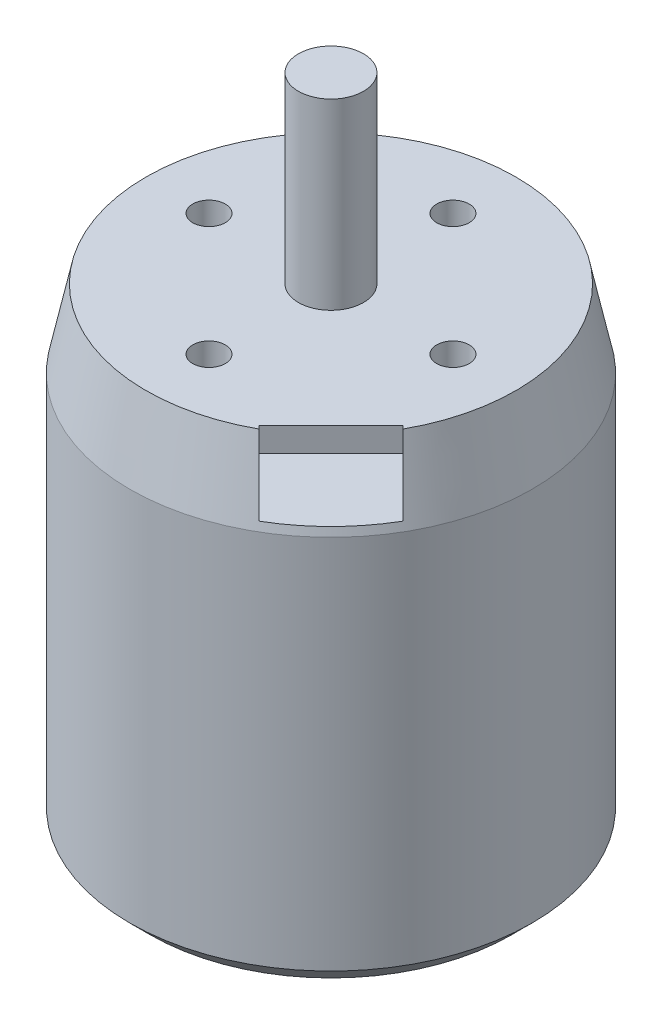
ISO-10303-21;
HEADER;
FILE_DESCRIPTION(('STEP AP214'),'2;1');
FILE_NAME('part.step','',(''),(''),'','','');
FILE_SCHEMA(('AUTOMOTIVE_DESIGN { 1 0 10303 214 1 1 1 1 }'));
ENDSEC;
DATA;
#1=APPLICATION_CONTEXT('core data for automotive mechanical design processes');
#2=APPLICATION_PROTOCOL_DEFINITION('international standard','automotive_design',2000,#1);
#3=PRODUCT_CONTEXT('',#1,'mechanical');
#4=PRODUCT('Part','Part','',(#3));
#5=PRODUCT_RELATED_PRODUCT_CATEGORY('part','',(#4));
#6=PRODUCT_DEFINITION_FORMATION('','',#4);
#7=PRODUCT_DEFINITION_CONTEXT('part definition',#1,'design');
#8=PRODUCT_DEFINITION('design','',#6,#7);
#9=PRODUCT_DEFINITION_SHAPE('','',#8);
#10=(LENGTH_UNIT() NAMED_UNIT(*) SI_UNIT(.MILLI.,.METRE.));
#11=(NAMED_UNIT(*) PLANE_ANGLE_UNIT() SI_UNIT($,.RADIAN.));
#12=(NAMED_UNIT(*) SI_UNIT($,.STERADIAN.) SOLID_ANGLE_UNIT());
#13=UNCERTAINTY_MEASURE_WITH_UNIT(LENGTH_MEASURE(1.E-05),#10,'distance_accuracy_value','');
#14=(GEOMETRIC_REPRESENTATION_CONTEXT(3) GLOBAL_UNCERTAINTY_ASSIGNED_CONTEXT((#13)) GLOBAL_UNIT_ASSIGNED_CONTEXT((#10,
#11,#12)) REPRESENTATION_CONTEXT('',''));
#15=CARTESIAN_POINT('',(0.,0.,0.));
#16=DIRECTION('',(0.,0.,1.));
#17=DIRECTION('',(1.,0.,0.));
#18=AXIS2_PLACEMENT_3D('',#15,#16,#17);
#19=CARTESIAN_POINT('',(0.,58.2,0.));
#20=DIRECTION('',(0.,-1.,0.));
#21=DIRECTION('',(0.,0.,-1.));
#22=AXIS2_PLACEMENT_3D('',#19,#20,#21);
#23=CYLINDRICAL_SURFACE('',#22,24.75);
#24=CARTESIAN_POINT('',(0.,48.7,0.));
#25=DIRECTION('',(0.,1.,0.));
#26=DIRECTION('',(0.,0.,1.));
#27=AXIS2_PLACEMENT_3D('',#24,#25,#26);
#28=CIRCLE('',#27,24.75);
#29=CARTESIAN_POINT('',(0.,48.7,24.75));
#30=VERTEX_POINT('',#29);
#31=EDGE_CURVE('E258',#30,#30,#28,.F.);
#32=ORIENTED_EDGE('',*,*,#31,.T.);
#33=EDGE_LOOP('',(#32));
#34=FACE_BOUND('',#33,.T.);
#35=CARTESIAN_POINT('',(0.,2.49999999999999,0.));
#36=DIRECTION('',(0.,1.,0.));
#37=DIRECTION('',(0.,0.,1.));
#38=AXIS2_PLACEMENT_3D('',#35,#36,#37);
#39=CIRCLE('',#38,24.75);
#40=CARTESIAN_POINT('',(0.,2.49999999999999,24.75));
#41=VERTEX_POINT('',#40);
#42=EDGE_CURVE('E238',#41,#41,#39,.T.);
#43=ORIENTED_EDGE('',*,*,#42,.T.);
#44=EDGE_LOOP('',(#43));
#45=FACE_BOUND('',#44,.T.);
#46=ADVANCED_FACE('F40',(#34,#45),#23,.T.);
#47=CARTESIAN_POINT('',(0.,58.2,0.));
#48=DIRECTION('',(0.,1.,0.));
#49=DIRECTION('',(0.,0.,1.));
#50=AXIS2_PLACEMENT_3D('',#47,#48,#49);
#51=PLANE('',#50);
#52=DIRECTION('',(-0.707106781186548,0.,-0.707106781186547));
#53=VECTOR('',#52,1.);
#54=CARTESIAN_POINT('',(19.5161471607487,58.2,10.6773123959169));
#55=LINE('',#54,#53);
#56=CARTESIAN_POINT('',(19.887125680674,58.2,11.0482909158421));
#57=VERTEX_POINT('',#56);
#58=CARTESIAN_POINT('',(19.5161471607487,58.2,10.6773123959169));
#59=VERTEX_POINT('',#58);
#60=EDGE_CURVE('E145',#57,#59,#55,.T.);
#61=ORIENTED_EDGE('',*,*,#60,.F.);
#62=CARTESIAN_POINT('',(0.,58.2,0.));
#63=DIRECTION('',(0.,1.,0.));
#64=DIRECTION('',(0.,0.,1.));
#65=AXIS2_PLACEMENT_3D('',#62,#63,#64);
#66=CIRCLE('',#65,22.75);
#67=CARTESIAN_POINT('',(11.0482909158421,58.2,19.887125680674));
#68=VERTEX_POINT('',#67);
#69=EDGE_CURVE('E254',#57,#68,#66,.T.);
#70=ORIENTED_EDGE('',*,*,#69,.T.);
#71=DIRECTION('',(0.707106781186548,0.,0.707106781186548));
#72=VECTOR('',#71,1.);
#73=CARTESIAN_POINT('',(10.6773123959169,58.2,19.5161471607487));
#74=LINE('',#73,#72);
#75=CARTESIAN_POINT('',(10.6773123959169,58.2,19.5161471607487));
#76=VERTEX_POINT('',#75);
#77=EDGE_CURVE('E149',#76,#68,#74,.T.);
#78=ORIENTED_EDGE('',*,*,#77,.F.);
#79=DIRECTION('',(-0.707106781186548,0.,0.707106781186547));
#80=VECTOR('',#79,1.);
#81=CARTESIAN_POINT('',(19.5161471607487,58.2,10.6773123959169));
#82=LINE('',#81,#80);
#83=EDGE_CURVE('E154',#59,#76,#82,.T.);
#84=ORIENTED_EDGE('',*,*,#83,.F.);
#85=EDGE_LOOP('',(#61,#70,#78,#84));
#86=FACE_BOUND('',#85,.T.);
#87=CARTESIAN_POINT('',(0.,58.2,-15.));
#88=DIRECTION('',(0.,1.,0.));
#89=DIRECTION('',(0.,0.,1.));
#90=AXIS2_PLACEMENT_3D('',#87,#88,#89);
#91=CIRCLE('',#90,2.);
#92=CARTESIAN_POINT('',(0.,58.2,-13.));
#93=VERTEX_POINT('',#92);
#94=EDGE_CURVE('E201',#93,#93,#91,.T.);
#95=ORIENTED_EDGE('',*,*,#94,.F.);
#96=EDGE_LOOP('',(#95));
#97=FACE_BOUND('',#96,.T.);
#98=CARTESIAN_POINT('',(15.,58.2,0.));
#99=DIRECTION('',(0.,1.,0.));
#100=DIRECTION('',(0.,0.,1.));
#101=AXIS2_PLACEMENT_3D('',#98,#99,#100);
#102=CIRCLE('',#101,2.);
#103=CARTESIAN_POINT('',(15.,58.2,2.));
#104=VERTEX_POINT('',#103);
#105=EDGE_CURVE('E209',#104,#104,#102,.T.);
#106=ORIENTED_EDGE('',*,*,#105,.F.);
#107=EDGE_LOOP('',(#106));
#108=FACE_BOUND('',#107,.T.);
#109=CARTESIAN_POINT('',(0.,58.2,15.));
#110=DIRECTION('',(0.,1.,0.));
#111=DIRECTION('',(0.,0.,1.));
#112=AXIS2_PLACEMENT_3D('',#109,#110,#111);
#113=CIRCLE('',#112,2.);
#114=CARTESIAN_POINT('',(0.,58.2,17.));
#115=VERTEX_POINT('',#114);
#116=EDGE_CURVE('E217',#115,#115,#113,.T.);
#117=ORIENTED_EDGE('',*,*,#116,.F.);
#118=EDGE_LOOP('',(#117));
#119=FACE_BOUND('',#118,.T.);
#120=CARTESIAN_POINT('',(-15.,58.2,0.));
#121=DIRECTION('',(0.,1.,0.));
#122=DIRECTION('',(0.,0.,1.));
#123=AXIS2_PLACEMENT_3D('',#120,#121,#122);
#124=CIRCLE('',#123,2.);
#125=CARTESIAN_POINT('',(-15.,58.2,2.));
#126=VERTEX_POINT('',#125);
#127=EDGE_CURVE('E170',#126,#126,#124,.T.);
#128=ORIENTED_EDGE('',*,*,#127,.F.);
#129=EDGE_LOOP('',(#128));
#130=FACE_BOUND('',#129,.T.);
#131=CARTESIAN_POINT('',(0.,58.2,0.));
#132=DIRECTION('',(0.,1.,0.));
#133=DIRECTION('',(0.,0.,1.));
#134=AXIS2_PLACEMENT_3D('',#131,#132,#133);
#135=CIRCLE('',#134,4.);
#136=CARTESIAN_POINT('',(0.,58.2,-4.));
#137=VERTEX_POINT('',#136);
#138=EDGE_CURVE('E234',#137,#137,#135,.T.);
#139=ORIENTED_EDGE('',*,*,#138,.F.);
#140=EDGE_LOOP('',(#139));
#141=FACE_BOUND('',#140,.T.);
#142=ADVANCED_FACE('F365',(#86,#97,#108,#119,#130,#141),#51,.T.);
#143=CARTESIAN_POINT('',(0.,0.,0.));
#144=DIRECTION('',(0.,1.,0.));
#145=DIRECTION('',(0.,0.,1.));
#146=AXIS2_PLACEMENT_3D('',#143,#144,#145);
#147=PLANE('',#146);
#148=CARTESIAN_POINT('',(0.,0.,9.875));
#149=DIRECTION('',(0.,-1.,0.));
#150=DIRECTION('',(0.,0.,-1.));
#151=AXIS2_PLACEMENT_3D('',#148,#149,#150);
#152=CIRCLE('',#151,1.5);
#153=CARTESIAN_POINT('',(0.,0.,8.375));
#154=VERTEX_POINT('',#153);
#155=EDGE_CURVE('E171',#154,#154,#152,.T.);
#156=ORIENTED_EDGE('',*,*,#155,.F.);
#157=EDGE_LOOP('',(#156));
#158=FACE_BOUND('',#157,.T.);
#159=CARTESIAN_POINT('',(9.875,0.,0.));
#160=DIRECTION('',(0.,-1.,0.));
#161=DIRECTION('',(0.,0.,-1.));
#162=AXIS2_PLACEMENT_3D('',#159,#160,#161);
#163=CIRCLE('',#162,1.5);
#164=CARTESIAN_POINT('',(9.875,0.,-1.5));
#165=VERTEX_POINT('',#164);
#166=EDGE_CURVE('E179',#165,#165,#163,.T.);
#167=ORIENTED_EDGE('',*,*,#166,.F.);
#168=EDGE_LOOP('',(#167));
#169=FACE_BOUND('',#168,.T.);
#170=CARTESIAN_POINT('',(0.,0.,-9.875));
#171=DIRECTION('',(0.,-1.,0.));
#172=DIRECTION('',(0.,0.,-1.));
#173=AXIS2_PLACEMENT_3D('',#170,#171,#172);
#174=CIRCLE('',#173,1.5);
#175=CARTESIAN_POINT('',(0.,0.,-11.375));
#176=VERTEX_POINT('',#175);
#177=EDGE_CURVE('E187',#176,#176,#174,.T.);
#178=ORIENTED_EDGE('',*,*,#177,.F.);
#179=EDGE_LOOP('',(#178));
#180=FACE_BOUND('',#179,.T.);
#181=CARTESIAN_POINT('',(-9.875,0.,0.));
#182=DIRECTION('',(0.,-1.,0.));
#183=DIRECTION('',(0.,0.,-1.));
#184=AXIS2_PLACEMENT_3D('',#181,#182,#183);
#185=CIRCLE('',#184,1.5);
#186=CARTESIAN_POINT('',(-9.875,0.,-1.5));
#187=VERTEX_POINT('',#186);
#188=EDGE_CURVE('E163',#187,#187,#185,.T.);
#189=ORIENTED_EDGE('',*,*,#188,.F.);
#190=EDGE_LOOP('',(#189));
#191=FACE_BOUND('',#190,.T.);
#192=CARTESIAN_POINT('',(0.,0.,0.));
#193=DIRECTION('',(0.,1.,0.));
#194=DIRECTION('',(0.,0.,1.));
#195=AXIS2_PLACEMENT_3D('',#192,#193,#194);
#196=CIRCLE('',#195,7.3);
#197=CARTESIAN_POINT('',(0.,0.,7.3));
#198=VERTEX_POINT('',#197);
#199=EDGE_CURVE('E250',#198,#198,#196,.T.);
#200=ORIENTED_EDGE('',*,*,#199,.T.);
#201=EDGE_LOOP('',(#200));
#202=FACE_BOUND('',#201,.T.);
#203=CARTESIAN_POINT('',(0.,0.,0.));
#204=DIRECTION('',(0.,1.,0.));
#205=DIRECTION('',(0.,0.,1.));
#206=AXIS2_PLACEMENT_3D('',#203,#204,#205);
#207=CIRCLE('',#206,22.25);
#208=CARTESIAN_POINT('',(0.,0.,22.25));
#209=VERTEX_POINT('',#208);
#210=EDGE_CURVE('E242',#209,#209,#207,.F.);
#211=ORIENTED_EDGE('',*,*,#210,.T.);
#212=EDGE_LOOP('',(#211));
#213=FACE_BOUND('',#212,.T.);
#214=ADVANCED_FACE('F363',(#158,#169,#180,#191,#202,#213),#147,.F.);
#215=CARTESIAN_POINT('',(0.,80.7,0.));
#216=DIRECTION('',(0.,-1.,0.));
#217=DIRECTION('',(0.,0.,-1.));
#218=AXIS2_PLACEMENT_3D('',#215,#216,#217);
#219=CYLINDRICAL_SURFACE('',#218,4.);
#220=CARTESIAN_POINT('',(0.,80.7,0.));
#221=DIRECTION('',(0.,1.,0.));
#222=DIRECTION('',(0.,0.,1.));
#223=AXIS2_PLACEMENT_3D('',#220,#221,#222);
#224=CIRCLE('',#223,4.);
#225=CARTESIAN_POINT('',(0.,80.7,-4.));
#226=VERTEX_POINT('',#225);
#227=EDGE_CURVE('E230',#226,#226,#224,.T.);
#228=CARTESIAN_POINT('',(0.,80.7,-4.));
#229=CARTESIAN_POINT('',(0.,80.465625,-4.));
#230=CARTESIAN_POINT('',(0.,80.23125,-4.));
#231=CARTESIAN_POINT('',(0.,79.7625,-4.));
#232=CARTESIAN_POINT('',(0.,79.528125,-4.));
#233=CARTESIAN_POINT('',(0.,79.059375,-4.));
#234=CARTESIAN_POINT('',(0.,78.825,-4.));
#235=CARTESIAN_POINT('',(0.,78.35625,-4.));
#236=CARTESIAN_POINT('',(0.,78.121875,-4.));
#237=CARTESIAN_POINT('',(0.,77.653125,-4.));
#238=CARTESIAN_POINT('',(0.,77.41875,-4.));
#239=CARTESIAN_POINT('',(0.,76.95,-4.));
#240=CARTESIAN_POINT('',(0.,76.715625,-4.));
#241=CARTESIAN_POINT('',(0.,76.246875,-4.));
#242=CARTESIAN_POINT('',(0.,76.0125,-4.));
#243=CARTESIAN_POINT('',(0.,75.54375,-4.));
#244=CARTESIAN_POINT('',(0.,75.309375,-4.));
#245=CARTESIAN_POINT('',(0.,74.840625,-4.));
#246=CARTESIAN_POINT('',(0.,74.60625,-4.));
#247=CARTESIAN_POINT('',(0.,74.1375,-4.));
#248=CARTESIAN_POINT('',(0.,73.903125,-4.));
#249=CARTESIAN_POINT('',(0.,73.434375,-4.));
#250=CARTESIAN_POINT('',(0.,73.2,-4.));
#251=CARTESIAN_POINT('',(0.,72.73125,-4.));
#252=CARTESIAN_POINT('',(0.,72.496875,-4.));
#253=CARTESIAN_POINT('',(0.,72.028125,-4.));
#254=CARTESIAN_POINT('',(0.,71.79375,-4.));
#255=CARTESIAN_POINT('',(0.,71.325,-4.));
#256=CARTESIAN_POINT('',(0.,71.090625,-4.));
#257=CARTESIAN_POINT('',(0.,70.621875,-4.));
#258=CARTESIAN_POINT('',(0.,70.3875,-4.));
#259=CARTESIAN_POINT('',(0.,69.91875,-4.));
#260=CARTESIAN_POINT('',(0.,69.684375,-4.));
#261=CARTESIAN_POINT('',(0.,69.215625,-4.));
#262=CARTESIAN_POINT('',(0.,68.98125,-4.));
#263=CARTESIAN_POINT('',(0.,68.5125,-4.));
#264=CARTESIAN_POINT('',(0.,68.278125,-4.));
#265=CARTESIAN_POINT('',(0.,67.809375,-4.));
#266=CARTESIAN_POINT('',(0.,67.575,-4.));
#267=CARTESIAN_POINT('',(0.,67.10625,-4.));
#268=CARTESIAN_POINT('',(0.,66.871875,-4.));
#269=CARTESIAN_POINT('',(0.,66.403125,-4.));
#270=CARTESIAN_POINT('',(0.,66.16875,-4.));
#271=CARTESIAN_POINT('',(0.,65.7,-4.));
#272=CARTESIAN_POINT('',(0.,65.465625,-4.));
#273=CARTESIAN_POINT('',(0.,64.996875,-4.));
#274=CARTESIAN_POINT('',(0.,64.7625,-4.));
#275=CARTESIAN_POINT('',(0.,64.29375,-4.));
#276=CARTESIAN_POINT('',(0.,64.059375,-4.));
#277=CARTESIAN_POINT('',(0.,63.590625,-4.));
#278=CARTESIAN_POINT('',(0.,63.35625,-4.));
#279=CARTESIAN_POINT('',(0.,62.8875,-4.));
#280=CARTESIAN_POINT('',(0.,62.653125,-4.));
#281=CARTESIAN_POINT('',(0.,62.184375,-4.));
#282=CARTESIAN_POINT('',(0.,61.95,-4.));
#283=CARTESIAN_POINT('',(0.,61.48125,-4.));
#284=CARTESIAN_POINT('',(0.,61.246875,-4.));
#285=CARTESIAN_POINT('',(0.,60.778125,-4.));
#286=CARTESIAN_POINT('',(0.,60.54375,-4.));
#287=CARTESIAN_POINT('',(0.,60.075,-4.));
#288=CARTESIAN_POINT('',(0.,59.840625,-4.));
#289=CARTESIAN_POINT('',(0.,59.371875,-4.));
#290=CARTESIAN_POINT('',(0.,59.1375,-4.));
#291=CARTESIAN_POINT('',(0.,58.66875,-4.));
#292=CARTESIAN_POINT('',(0.,58.434375,-4.));
#293=CARTESIAN_POINT('',(0.,58.2,-4.));
#294=B_SPLINE_CURVE_WITH_KNOTS('',3,(#228,#229,#230,#231,#232,#233,#234,#235,#236,#237,#238,
#239,#240,#241,#242,#243,#244,#245,#246,#247,#248,#249,#250,#251,#252,#253,#254,#255,#256,#257,
#258,#259,#260,#261,#262,#263,#264,#265,#266,#267,#268,#269,#270,#271,#272,#273,#274,#275,#276,
#277,#278,#279,#280,#281,#282,#283,#284,#285,#286,#287,#288,#289,#290,#291,#292,#293),
.UNSPECIFIED.,.F.,.F.,(4,2,2,2,2,2,2,2,2,2,2,2,2,2,2,2,2,2,2,2,2,2,2,2,2,2,2,2,2,2,2,2,4),(0.,
0.703124999999999,1.40625,2.109375,2.8125,3.51562499999999,4.21874999999999,4.92187499999999,
5.62499999999999,6.32812499999999,7.03124999999999,7.73437499999999,8.43749999999999,
9.14062499999999,9.84374999999998,10.546875,11.25,11.953125,12.65625,13.359375,14.0625,
14.765625,15.46875,16.171875,16.875,17.578125,18.28125,18.984375,19.6875,20.390625,21.09375,
21.796875,22.5),.UNSPECIFIED.);
#295=EDGE_CURVE('BSEAM359',#226,#137,#294,.T.);
#296=ORIENTED_EDGE('',*,*,#227,.F.);
#297=ORIENTED_EDGE('',*,*,#138,.T.);
#298=ORIENTED_EDGE('',*,*,#295,.T.);
#299=ORIENTED_EDGE('',*,*,#295,.F.);
#300=EDGE_LOOP('',(#296,#298,#297,#299));
#301=FACE_BOUND('',#300,.T.);
#302=ADVANCED_FACE('F359',(#301),#219,.T.);
#303=CARTESIAN_POINT('',(0.,80.7,0.));
#304=DIRECTION('',(0.,1.,0.));
#305=DIRECTION('',(0.,0.,1.));
#306=AXIS2_PLACEMENT_3D('',#303,#304,#305);
#307=PLANE('',#306);
#308=ORIENTED_EDGE('',*,*,#227,.T.);
#309=EDGE_LOOP('',(#308));
#310=FACE_BOUND('',#309,.T.);
#311=ADVANCED_FACE('F356',(#310),#307,.T.);
#312=CARTESIAN_POINT('',(0.,2.49999999999999,0.));
#313=DIRECTION('',(0.,1.,0.));
#314=DIRECTION('',(0.,0.,1.));
#315=AXIS2_PLACEMENT_3D('',#312,#313,#314);
#316=CONICAL_SURFACE('',#315,24.75,0.785398163397451);
#317=ORIENTED_EDGE('',*,*,#210,.F.);
#318=EDGE_LOOP('',(#317));
#319=FACE_BOUND('',#318,.T.);
#320=ORIENTED_EDGE('',*,*,#42,.F.);
#321=EDGE_LOOP('',(#320));
#322=FACE_BOUND('',#321,.T.);
#323=ADVANCED_FACE('F354',(#319,#322),#316,.T.);
#324=CARTESIAN_POINT('',(0.,-2.,0.));
#325=DIRECTION('',(0.,1.,0.));
#326=DIRECTION('',(0.,0.,1.));
#327=AXIS2_PLACEMENT_3D('',#324,#325,#326);
#328=CYLINDRICAL_SURFACE('',#327,6.8);
#329=CARTESIAN_POINT('',(0.,-0.5,0.));
#330=DIRECTION('',(0.,1.,0.));
#331=DIRECTION('',(0.,0.,1.));
#332=AXIS2_PLACEMENT_3D('',#329,#330,#331);
#333=CIRCLE('',#332,6.8);
#334=CARTESIAN_POINT('',(0.,-0.5,6.8));
#335=VERTEX_POINT('',#334);
#336=EDGE_CURVE('E246',#335,#335,#333,.F.);
#337=ORIENTED_EDGE('',*,*,#336,.T.);
#338=EDGE_LOOP('',(#337));
#339=FACE_BOUND('',#338,.T.);
#340=CARTESIAN_POINT('',(0.,-2.,0.));
#341=DIRECTION('',(0.,-1.,0.));
#342=DIRECTION('',(0.,0.,-1.));
#343=AXIS2_PLACEMENT_3D('',#340,#341,#342);
#344=CIRCLE('',#343,6.8);
#345=CARTESIAN_POINT('',(0.,-2.,-6.8));
#346=VERTEX_POINT('',#345);
#347=EDGE_CURVE('E200',#346,#346,#344,.T.);
#348=ORIENTED_EDGE('',*,*,#347,.F.);
#349=EDGE_LOOP('',(#348));
#350=FACE_BOUND('',#349,.T.);
#351=ADVANCED_FACE('F350',(#339,#350),#328,.T.);
#352=CARTESIAN_POINT('',(0.,-2.,0.));
#353=DIRECTION('',(0.,-1.,0.));
#354=DIRECTION('',(0.,0.,-1.));
#355=AXIS2_PLACEMENT_3D('',#352,#353,#354);
#356=PLANE('',#355);
#357=ORIENTED_EDGE('',*,*,#347,.T.);
#358=EDGE_LOOP('',(#357));
#359=FACE_BOUND('',#358,.T.);
#360=ADVANCED_FACE('F347',(#359),#356,.T.);
#361=CARTESIAN_POINT('',(0.,-0.5,0.));
#362=DIRECTION('',(0.,1.,0.));
#363=DIRECTION('',(0.,0.,1.));
#364=AXIS2_PLACEMENT_3D('',#361,#362,#363);
#365=TOROIDAL_SURFACE('',#364,7.3,0.5);
#366=ORIENTED_EDGE('',*,*,#199,.F.);
#367=EDGE_LOOP('',(#366));
#368=FACE_BOUND('',#367,.T.);
#369=ORIENTED_EDGE('',*,*,#336,.F.);
#370=EDGE_LOOP('',(#369));
#371=FACE_BOUND('',#370,.T.);
#372=ADVANCED_FACE('F345',(#368,#371),#365,.F.);
#373=CARTESIAN_POINT('',(-15.,48.2,0.));
#374=DIRECTION('',(0.,1.,0.));
#375=DIRECTION('',(0.,0.,1.));
#376=AXIS2_PLACEMENT_3D('',#373,#374,#375);
#377=CYLINDRICAL_SURFACE('',#376,2.);
#378=CARTESIAN_POINT('',(-15.,48.2,0.));
#379=DIRECTION('',(0.,1.,0.));
#380=DIRECTION('',(0.,0.,1.));
#381=AXIS2_PLACEMENT_3D('',#378,#379,#380);
#382=CIRCLE('',#381,2.);
#383=CARTESIAN_POINT('',(-15.,48.2,2.));
#384=VERTEX_POINT('',#383);
#385=EDGE_CURVE('E221',#384,#384,#382,.T.);
#386=ORIENTED_EDGE('',*,*,#385,.F.);
#387=EDGE_LOOP('',(#386));
#388=FACE_BOUND('',#387,.T.);
#389=ORIENTED_EDGE('',*,*,#127,.T.);
#390=EDGE_LOOP('',(#389));
#391=FACE_BOUND('',#390,.T.);
#392=ADVANCED_FACE('F341',(#388,#391),#377,.F.);
#393=CARTESIAN_POINT('',(-15.,48.2,0.));
#394=DIRECTION('',(0.,1.,0.));
#395=DIRECTION('',(0.,0.,1.));
#396=AXIS2_PLACEMENT_3D('',#393,#394,#395);
#397=PLANE('',#396);
#398=ORIENTED_EDGE('',*,*,#385,.T.);
#399=EDGE_LOOP('',(#398));
#400=FACE_BOUND('',#399,.T.);
#401=ADVANCED_FACE('F337',(#400),#397,.T.);
#402=CARTESIAN_POINT('',(0.,48.2,15.));
#403=DIRECTION('',(0.,1.,0.));
#404=DIRECTION('',(0.,0.,1.));
#405=AXIS2_PLACEMENT_3D('',#402,#403,#404);
#406=CYLINDRICAL_SURFACE('',#405,2.);
#407=CARTESIAN_POINT('',(0.,48.2,15.));
#408=DIRECTION('',(0.,1.,0.));
#409=DIRECTION('',(0.,0.,1.));
#410=AXIS2_PLACEMENT_3D('',#407,#408,#409);
#411=CIRCLE('',#410,2.);
#412=CARTESIAN_POINT('',(0.,48.2,17.));
#413=VERTEX_POINT('',#412);
#414=EDGE_CURVE('E213',#413,#413,#411,.T.);
#415=ORIENTED_EDGE('',*,*,#414,.F.);
#416=EDGE_LOOP('',(#415));
#417=FACE_BOUND('',#416,.T.);
#418=ORIENTED_EDGE('',*,*,#116,.T.);
#419=EDGE_LOOP('',(#418));
#420=FACE_BOUND('',#419,.T.);
#421=ADVANCED_FACE('F333',(#417,#420),#406,.F.);
#422=CARTESIAN_POINT('',(0.,48.2,15.));
#423=DIRECTION('',(0.,1.,0.));
#424=DIRECTION('',(0.,0.,1.));
#425=AXIS2_PLACEMENT_3D('',#422,#423,#424);
#426=PLANE('',#425);
#427=ORIENTED_EDGE('',*,*,#414,.T.);
#428=EDGE_LOOP('',(#427));
#429=FACE_BOUND('',#428,.T.);
#430=ADVANCED_FACE('F329',(#429),#426,.T.);
#431=CARTESIAN_POINT('',(15.,48.2,0.));
#432=DIRECTION('',(0.,1.,0.));
#433=DIRECTION('',(0.,0.,1.));
#434=AXIS2_PLACEMENT_3D('',#431,#432,#433);
#435=CYLINDRICAL_SURFACE('',#434,2.);
#436=CARTESIAN_POINT('',(15.,48.2,0.));
#437=DIRECTION('',(0.,1.,0.));
#438=DIRECTION('',(0.,0.,1.));
#439=AXIS2_PLACEMENT_3D('',#436,#437,#438);
#440=CIRCLE('',#439,2.);
#441=CARTESIAN_POINT('',(15.,48.2,2.));
#442=VERTEX_POINT('',#441);
#443=EDGE_CURVE('E205',#442,#442,#440,.T.);
#444=ORIENTED_EDGE('',*,*,#443,.F.);
#445=EDGE_LOOP('',(#444));
#446=FACE_BOUND('',#445,.T.);
#447=ORIENTED_EDGE('',*,*,#105,.T.);
#448=EDGE_LOOP('',(#447));
#449=FACE_BOUND('',#448,.T.);
#450=ADVANCED_FACE('F325',(#446,#449),#435,.F.);
#451=CARTESIAN_POINT('',(15.,48.2,0.));
#452=DIRECTION('',(0.,1.,0.));
#453=DIRECTION('',(0.,0.,1.));
#454=AXIS2_PLACEMENT_3D('',#451,#452,#453);
#455=PLANE('',#454);
#456=ORIENTED_EDGE('',*,*,#443,.T.);
#457=EDGE_LOOP('',(#456));
#458=FACE_BOUND('',#457,.T.);
#459=ADVANCED_FACE('F321',(#458),#455,.T.);
#460=CARTESIAN_POINT('',(0.,48.2,-15.));
#461=DIRECTION('',(0.,1.,0.));
#462=DIRECTION('',(0.,0.,1.));
#463=AXIS2_PLACEMENT_3D('',#460,#461,#462);
#464=CYLINDRICAL_SURFACE('',#463,2.);
#465=CARTESIAN_POINT('',(0.,48.2,-15.));
#466=DIRECTION('',(0.,1.,0.));
#467=DIRECTION('',(0.,0.,1.));
#468=AXIS2_PLACEMENT_3D('',#465,#466,#467);
#469=CIRCLE('',#468,2.);
#470=CARTESIAN_POINT('',(0.,48.2,-13.));
#471=VERTEX_POINT('',#470);
#472=EDGE_CURVE('E196',#471,#471,#469,.T.);
#473=ORIENTED_EDGE('',*,*,#472,.F.);
#474=EDGE_LOOP('',(#473));
#475=FACE_BOUND('',#474,.T.);
#476=ORIENTED_EDGE('',*,*,#94,.T.);
#477=EDGE_LOOP('',(#476));
#478=FACE_BOUND('',#477,.T.);
#479=ADVANCED_FACE('F317',(#475,#478),#464,.F.);
#480=CARTESIAN_POINT('',(0.,48.2,-15.));
#481=DIRECTION('',(0.,1.,0.));
#482=DIRECTION('',(0.,0.,1.));
#483=AXIS2_PLACEMENT_3D('',#480,#481,#482);
#484=PLANE('',#483);
#485=ORIENTED_EDGE('',*,*,#472,.T.);
#486=EDGE_LOOP('',(#485));
#487=FACE_BOUND('',#486,.T.);
#488=ADVANCED_FACE('F313',(#487),#484,.T.);
#489=CARTESIAN_POINT('',(-9.875,5.,0.));
#490=DIRECTION('',(0.,-1.,0.));
#491=DIRECTION('',(0.,0.,-1.));
#492=AXIS2_PLACEMENT_3D('',#489,#490,#491);
#493=CYLINDRICAL_SURFACE('',#492,1.5);
#494=CARTESIAN_POINT('',(-9.875,5.,0.));
#495=DIRECTION('',(0.,-1.,0.));
#496=DIRECTION('',(0.,0.,-1.));
#497=AXIS2_PLACEMENT_3D('',#494,#495,#496);
#498=CIRCLE('',#497,1.5);
#499=CARTESIAN_POINT('',(-9.875,5.,-1.5));
#500=VERTEX_POINT('',#499);
#501=EDGE_CURVE('E191',#500,#500,#498,.T.);
#502=ORIENTED_EDGE('',*,*,#501,.F.);
#503=EDGE_LOOP('',(#502));
#504=FACE_BOUND('',#503,.T.);
#505=ORIENTED_EDGE('',*,*,#188,.T.);
#506=EDGE_LOOP('',(#505));
#507=FACE_BOUND('',#506,.T.);
#508=ADVANCED_FACE('F309',(#504,#507),#493,.F.);
#509=CARTESIAN_POINT('',(-9.875,5.,0.));
#510=DIRECTION('',(0.,-1.,0.));
#511=DIRECTION('',(0.,0.,-1.));
#512=AXIS2_PLACEMENT_3D('',#509,#510,#511);
#513=PLANE('',#512);
#514=ORIENTED_EDGE('',*,*,#501,.T.);
#515=EDGE_LOOP('',(#514));
#516=FACE_BOUND('',#515,.T.);
#517=ADVANCED_FACE('F305',(#516),#513,.T.);
#518=CARTESIAN_POINT('',(0.,5.,-9.875));
#519=DIRECTION('',(0.,-1.,0.));
#520=DIRECTION('',(0.,0.,-1.));
#521=AXIS2_PLACEMENT_3D('',#518,#519,#520);
#522=CYLINDRICAL_SURFACE('',#521,1.5);
#523=CARTESIAN_POINT('',(0.,5.,-9.875));
#524=DIRECTION('',(0.,-1.,0.));
#525=DIRECTION('',(0.,0.,-1.));
#526=AXIS2_PLACEMENT_3D('',#523,#524,#525);
#527=CIRCLE('',#526,1.5);
#528=CARTESIAN_POINT('',(0.,5.,-11.375));
#529=VERTEX_POINT('',#528);
#530=EDGE_CURVE('E183',#529,#529,#527,.T.);
#531=ORIENTED_EDGE('',*,*,#530,.F.);
#532=EDGE_LOOP('',(#531));
#533=FACE_BOUND('',#532,.T.);
#534=ORIENTED_EDGE('',*,*,#177,.T.);
#535=EDGE_LOOP('',(#534));
#536=FACE_BOUND('',#535,.T.);
#537=ADVANCED_FACE('F301',(#533,#536),#522,.F.);
#538=CARTESIAN_POINT('',(0.,5.,-9.875));
#539=DIRECTION('',(0.,-1.,0.));
#540=DIRECTION('',(0.,0.,-1.));
#541=AXIS2_PLACEMENT_3D('',#538,#539,#540);
#542=PLANE('',#541);
#543=ORIENTED_EDGE('',*,*,#530,.T.);
#544=EDGE_LOOP('',(#543));
#545=FACE_BOUND('',#544,.T.);
#546=ADVANCED_FACE('F297',(#545),#542,.T.);
#547=CARTESIAN_POINT('',(9.875,5.,0.));
#548=DIRECTION('',(0.,-1.,0.));
#549=DIRECTION('',(0.,0.,-1.));
#550=AXIS2_PLACEMENT_3D('',#547,#548,#549);
#551=CYLINDRICAL_SURFACE('',#550,1.5);
#552=CARTESIAN_POINT('',(9.875,5.,0.));
#553=DIRECTION('',(0.,-1.,0.));
#554=DIRECTION('',(0.,0.,-1.));
#555=AXIS2_PLACEMENT_3D('',#552,#553,#554);
#556=CIRCLE('',#555,1.5);
#557=CARTESIAN_POINT('',(9.875,5.,-1.5));
#558=VERTEX_POINT('',#557);
#559=EDGE_CURVE('E175',#558,#558,#556,.T.);
#560=ORIENTED_EDGE('',*,*,#559,.F.);
#561=EDGE_LOOP('',(#560));
#562=FACE_BOUND('',#561,.T.);
#563=ORIENTED_EDGE('',*,*,#166,.T.);
#564=EDGE_LOOP('',(#563));
#565=FACE_BOUND('',#564,.T.);
#566=ADVANCED_FACE('F293',(#562,#565),#551,.F.);
#567=CARTESIAN_POINT('',(9.875,5.,0.));
#568=DIRECTION('',(0.,-1.,0.));
#569=DIRECTION('',(0.,0.,-1.));
#570=AXIS2_PLACEMENT_3D('',#567,#568,#569);
#571=PLANE('',#570);
#572=ORIENTED_EDGE('',*,*,#559,.T.);
#573=EDGE_LOOP('',(#572));
#574=FACE_BOUND('',#573,.T.);
#575=ADVANCED_FACE('F289',(#574),#571,.T.);
#576=CARTESIAN_POINT('',(0.,5.,9.875));
#577=DIRECTION('',(0.,-1.,0.));
#578=DIRECTION('',(0.,0.,-1.));
#579=AXIS2_PLACEMENT_3D('',#576,#577,#578);
#580=CYLINDRICAL_SURFACE('',#579,1.5);
#581=CARTESIAN_POINT('',(0.,5.,9.875));
#582=DIRECTION('',(0.,-1.,0.));
#583=DIRECTION('',(0.,0.,-1.));
#584=AXIS2_PLACEMENT_3D('',#581,#582,#583);
#585=CIRCLE('',#584,1.5);
#586=CARTESIAN_POINT('',(0.,5.,8.375));
#587=VERTEX_POINT('',#586);
#588=EDGE_CURVE('E166',#587,#587,#585,.T.);
#589=ORIENTED_EDGE('',*,*,#588,.F.);
#590=EDGE_LOOP('',(#589));
#591=FACE_BOUND('',#590,.T.);
#592=ORIENTED_EDGE('',*,*,#155,.T.);
#593=EDGE_LOOP('',(#592));
#594=FACE_BOUND('',#593,.T.);
#595=ADVANCED_FACE('F285',(#591,#594),#580,.F.);
#596=CARTESIAN_POINT('',(0.,5.,9.875));
#597=DIRECTION('',(0.,-1.,0.));
#598=DIRECTION('',(0.,0.,-1.));
#599=AXIS2_PLACEMENT_3D('',#596,#597,#598);
#600=PLANE('',#599);
#601=ORIENTED_EDGE('',*,*,#588,.T.);
#602=EDGE_LOOP('',(#601));
#603=FACE_BOUND('',#602,.T.);
#604=ADVANCED_FACE('F282',(#603),#600,.T.);
#605=CARTESIAN_POINT('',(0.,58.2,0.));
#606=DIRECTION('',(0.,-1.,0.));
#607=DIRECTION('',(0.,0.,-1.));
#608=AXIS2_PLACEMENT_3D('',#605,#606,#607);
#609=CONICAL_SURFACE('',#608,22.75,0.2074962264352);
#610=CARTESIAN_POINT('',(21.1992465707871,49.6998,12.3604118059553));
#611=CARTESIAN_POINT('',(20.9811489575796,51.1167168242027,12.1423141927478));
#612=CARTESIAN_POINT('',(20.7627541634698,52.5335419006118,11.923919398638));
#613=CARTESIAN_POINT('',(20.3253702119888,55.3670085672797,11.486535447157));
#614=CARTESIAN_POINT('',(20.1063810546137,56.7836501575372,11.2675462897819));
#615=CARTESIAN_POINT('',(19.8870947163323,58.2002,11.0482599515005));
#616=B_SPLINE_CURVE_WITH_KNOTS('',3,(#610,#611,#612,#613,#614,#615),.UNSPECIFIED.,.F.,.F.,(4,2,
4),(0.,4.35029571684189,8.70059146266053),.UNSPECIFIED.);
#617=CARTESIAN_POINT('',(21.1992157825467,49.7,12.3603810177148));
#618=VERTEX_POINT('',#617);
#619=EDGE_CURVE('E11',#618,#57,#616,.T.);
#620=ORIENTED_EDGE('',*,*,#619,.F.);
#621=CARTESIAN_POINT('',(0.,49.7,0.));
#622=DIRECTION('',(0.,-1.,0.));
#623=DIRECTION('',(0.,0.,-1.));
#624=AXIS2_PLACEMENT_3D('',#621,#622,#623);
#625=CIRCLE('',#624,24.5394736842105);
#626=CARTESIAN_POINT('',(12.3603810177148,49.7,21.1992157825467));
#627=VERTEX_POINT('',#626);
#628=EDGE_CURVE('E71',#627,#618,#625,.F.);
#629=ORIENTED_EDGE('',*,*,#628,.F.);
#630=CARTESIAN_POINT('',(11.0482599515005,58.2002,19.8870947163323));
#631=CARTESIAN_POINT('',(11.2675462897819,56.7836501575372,20.1063810546137));
#632=CARTESIAN_POINT('',(11.486535447157,55.3670085672797,20.3253702119888));
#633=CARTESIAN_POINT('',(11.923919398638,52.5335419006118,20.7627541634698));
#634=CARTESIAN_POINT('',(12.1423141927478,51.1167168242027,20.9811489575796));
#635=CARTESIAN_POINT('',(12.3604118059553,49.6998,21.1992465707871));
#636=B_SPLINE_CURVE_WITH_KNOTS('',3,(#630,#631,#632,#633,#634,#635),.UNSPECIFIED.,.F.,.F.,(4,2,
4),(0.,4.35029574581864,8.70059146266053),.UNSPECIFIED.);
#637=EDGE_CURVE('E55',#68,#627,#636,.T.);
#638=ORIENTED_EDGE('',*,*,#637,.F.);
#639=ORIENTED_EDGE('',*,*,#69,.F.);
#640=EDGE_LOOP('',(#620,#629,#638,#639));
#641=FACE_BOUND('',#640,.T.);
#642=ORIENTED_EDGE('',*,*,#31,.F.);
#643=EDGE_LOOP('',(#642));
#644=FACE_BOUND('',#643,.T.);
#645=ADVANCED_FACE('F42',(#641,#644),#609,.T.);
#646=CARTESIAN_POINT('',(19.5161471607487,49.7,10.6773123959169));
#647=DIRECTION('',(0.707106781186547,0.,-0.707106781186548));
#648=DIRECTION('',(-0.707106781186548,0.,-0.707106781186547));
#649=AXIS2_PLACEMENT_3D('',#646,#647,#648);
#650=PLANE('',#649);
#651=ORIENTED_EDGE('',*,*,#619,.T.);
#652=ORIENTED_EDGE('',*,*,#60,.T.);
#653=DIRECTION('',(0.,1.,0.));
#654=VECTOR('',#653,1.);
#655=CARTESIAN_POINT('',(19.5161471607487,49.7,10.6773123959169));
#656=LINE('',#655,#654);
#657=CARTESIAN_POINT('',(19.5161471607487,55.2,10.6773123959169));
#658=VERTEX_POINT('',#657);
#659=EDGE_CURVE('E115',#658,#59,#656,.T.);
#660=ORIENTED_EDGE('',*,*,#659,.F.);
#661=DIRECTION('',(0.707106781186547,0.,0.707106781186547));
#662=VECTOR('',#661,1.);
#663=CARTESIAN_POINT('',(13.5057395206631,55.2,4.66690475583124));
#664=LINE('',#663,#662);
#665=CARTESIAN_POINT('',(13.5057395206631,55.2,4.66690475583124));
#666=VERTEX_POINT('',#665);
#667=EDGE_CURVE('E140',#666,#658,#664,.T.);
#668=ORIENTED_EDGE('',*,*,#667,.F.);
#669=DIRECTION('',(0.,1.,0.));
#670=VECTOR('',#669,1.);
#671=CARTESIAN_POINT('',(13.5057395206631,49.7,4.66690475583124));
#672=LINE('',#671,#670);
#673=CARTESIAN_POINT('',(13.5057395206631,49.7,4.66690475583124));
#674=VERTEX_POINT('',#673);
#675=EDGE_CURVE('E125',#674,#666,#672,.T.);
#676=ORIENTED_EDGE('',*,*,#675,.F.);
#677=DIRECTION('',(-0.707106781186548,0.,-0.707106781186547));
#678=VECTOR('',#677,1.);
#679=CARTESIAN_POINT('',(19.5161471607487,49.7,10.6773123959169));
#680=LINE('',#679,#678);
#681=EDGE_CURVE('E116',#618,#674,#680,.T.);
#682=ORIENTED_EDGE('',*,*,#681,.F.);
#683=EDGE_LOOP('',(#651,#652,#660,#668,#676,#682));
#684=FACE_BOUND('',#683,.T.);
#685=ADVANCED_FACE('F274',(#684),#650,.F.);
#686=CARTESIAN_POINT('',(10.6773123959169,49.7,19.5161471607487));
#687=DIRECTION('',(-0.707106781186548,0.,0.707106781186547));
#688=DIRECTION('',(0.707106781186547,0.,0.707106781186548));
#689=AXIS2_PLACEMENT_3D('',#686,#687,#688);
#690=PLANE('',#689);
#691=ORIENTED_EDGE('',*,*,#637,.T.);
#692=DIRECTION('',(0.707106781186548,0.,0.707106781186548));
#693=VECTOR('',#692,1.);
#694=CARTESIAN_POINT('',(10.6773123959169,49.7,19.5161471607487));
#695=LINE('',#694,#693);
#696=CARTESIAN_POINT('',(4.66690475583124,49.7,13.5057395206631));
#697=VERTEX_POINT('',#696);
#698=EDGE_CURVE('E65',#697,#627,#695,.T.);
#699=ORIENTED_EDGE('',*,*,#698,.F.);
#700=DIRECTION('',(0.,-1.,0.));
#701=VECTOR('',#700,1.);
#702=CARTESIAN_POINT('',(4.66690475583124,49.7,13.5057395206631));
#703=LINE('',#702,#701);
#704=CARTESIAN_POINT('',(4.66690475583124,55.2,13.5057395206631));
#705=VERTEX_POINT('',#704);
#706=EDGE_CURVE('E111',#705,#697,#703,.T.);
#707=ORIENTED_EDGE('',*,*,#706,.F.);
#708=DIRECTION('',(0.707106781186547,0.,0.707106781186547));
#709=VECTOR('',#708,1.);
#710=CARTESIAN_POINT('',(4.66690475583124,55.2,13.5057395206631));
#711=LINE('',#710,#709);
#712=CARTESIAN_POINT('',(10.6773123959169,55.2,19.5161471607487));
#713=VERTEX_POINT('',#712);
#714=EDGE_CURVE('E142',#705,#713,#711,.T.);
#715=ORIENTED_EDGE('',*,*,#714,.T.);
#716=DIRECTION('',(0.,1.,0.));
#717=VECTOR('',#716,1.);
#718=CARTESIAN_POINT('',(10.6773123959169,49.7,19.5161471607487));
#719=LINE('',#718,#717);
#720=EDGE_CURVE('E160',#713,#76,#719,.T.);
#721=ORIENTED_EDGE('',*,*,#720,.T.);
#722=ORIENTED_EDGE('',*,*,#77,.T.);
#723=EDGE_LOOP('',(#691,#699,#707,#715,#721,#722));
#724=FACE_BOUND('',#723,.T.);
#725=ADVANCED_FACE('F109',(#724),#690,.F.);
#726=CARTESIAN_POINT('',(19.5161471607487,49.7,10.6773123959169));
#727=DIRECTION('',(-0.707106781186547,0.,-0.707106781186548));
#728=DIRECTION('',(-0.707106781186548,0.,0.707106781186547));
#729=AXIS2_PLACEMENT_3D('',#726,#727,#728);
#730=PLANE('',#729);
#731=ORIENTED_EDGE('',*,*,#720,.F.);
#732=DIRECTION('',(-0.707106781186547,0.,0.707106781186548));
#733=VECTOR('',#732,1.);
#734=CARTESIAN_POINT('',(10.6773123959169,55.2,19.5161471607487));
#735=LINE('',#734,#733);
#736=EDGE_CURVE('E131',#658,#713,#735,.T.);
#737=ORIENTED_EDGE('',*,*,#736,.F.);
#738=ORIENTED_EDGE('',*,*,#659,.T.);
#739=ORIENTED_EDGE('',*,*,#83,.T.);
#740=EDGE_LOOP('',(#731,#737,#738,#739));
#741=FACE_BOUND('',#740,.T.);
#742=ADVANCED_FACE('F273',(#741),#730,.F.);
#743=CARTESIAN_POINT('',(0.,49.7,0.));
#744=DIRECTION('',(0.,-1.,0.));
#745=DIRECTION('',(0.,0.,-1.));
#746=AXIS2_PLACEMENT_3D('',#743,#744,#745);
#747=PLANE('',#746);
#748=ORIENTED_EDGE('',*,*,#628,.T.);
#749=ORIENTED_EDGE('',*,*,#681,.T.);
#750=DIRECTION('',(0.707106781186547,0.,-0.707106781186548));
#751=VECTOR('',#750,1.);
#752=CARTESIAN_POINT('',(4.66690475583124,49.7,13.5057395206631));
#753=LINE('',#752,#751);
#754=EDGE_CURVE('E119',#697,#674,#753,.T.);
#755=ORIENTED_EDGE('',*,*,#754,.F.);
#756=ORIENTED_EDGE('',*,*,#698,.T.);
#757=EDGE_LOOP('',(#748,#749,#755,#756));
#758=FACE_BOUND('',#757,.T.);
#759=ADVANCED_FACE('F120',(#758),#747,.F.);
#760=CARTESIAN_POINT('',(4.66690475583124,55.2,13.5057395206631));
#761=DIRECTION('',(0.,1.,0.));
#762=DIRECTION('',(0.,0.,1.));
#763=AXIS2_PLACEMENT_3D('',#760,#761,#762);
#764=PLANE('',#763);
#765=ORIENTED_EDGE('',*,*,#736,.T.);
#766=ORIENTED_EDGE('',*,*,#714,.F.);
#767=DIRECTION('',(-0.707106781186547,0.,0.707106781186548));
#768=VECTOR('',#767,1.);
#769=CARTESIAN_POINT('',(4.66690475583124,55.2,13.5057395206631));
#770=LINE('',#769,#768);
#771=EDGE_CURVE('E129',#666,#705,#770,.T.);
#772=ORIENTED_EDGE('',*,*,#771,.F.);
#773=ORIENTED_EDGE('',*,*,#667,.T.);
#774=EDGE_LOOP('',(#765,#766,#772,#773));
#775=FACE_BOUND('',#774,.T.);
#776=ADVANCED_FACE('F492',(#775),#764,.F.);
#777=CARTESIAN_POINT('',(9.08632213824716,0.,9.08632213824716));
#778=DIRECTION('',(-0.707106781186548,0.,-0.707106781186547));
#779=DIRECTION('',(-0.707106781186547,0.,0.707106781186548));
#780=AXIS2_PLACEMENT_3D('',#777,#778,#779);
#781=PLANE('',#780);
#782=ORIENTED_EDGE('',*,*,#706,.T.);
#783=ORIENTED_EDGE('',*,*,#754,.T.);
#784=ORIENTED_EDGE('',*,*,#675,.T.);
#785=ORIENTED_EDGE('',*,*,#771,.T.);
#786=EDGE_LOOP('',(#782,#783,#784,#785));
#787=FACE_BOUND('',#786,.T.);
#788=ADVANCED_FACE('F127',(#787),#781,.F.);
#789=CLOSED_SHELL('',(#46,#142,#214,#302,#311,#323,#351,#360,#372,#392,#401,#421,#430,#450,#459,
#479,#488,#508,#517,#537,#546,#566,#575,#595,#604,#645,#685,#725,#742,#759,#776,#788));
#790=MANIFOLD_SOLID_BREP('B2',#789);
#791=ADVANCED_BREP_SHAPE_REPRESENTATION('',(#18,#790),#14);
#792=SHAPE_DEFINITION_REPRESENTATION(#9,#791);
ENDSEC;
END-ISO-10303-21;
